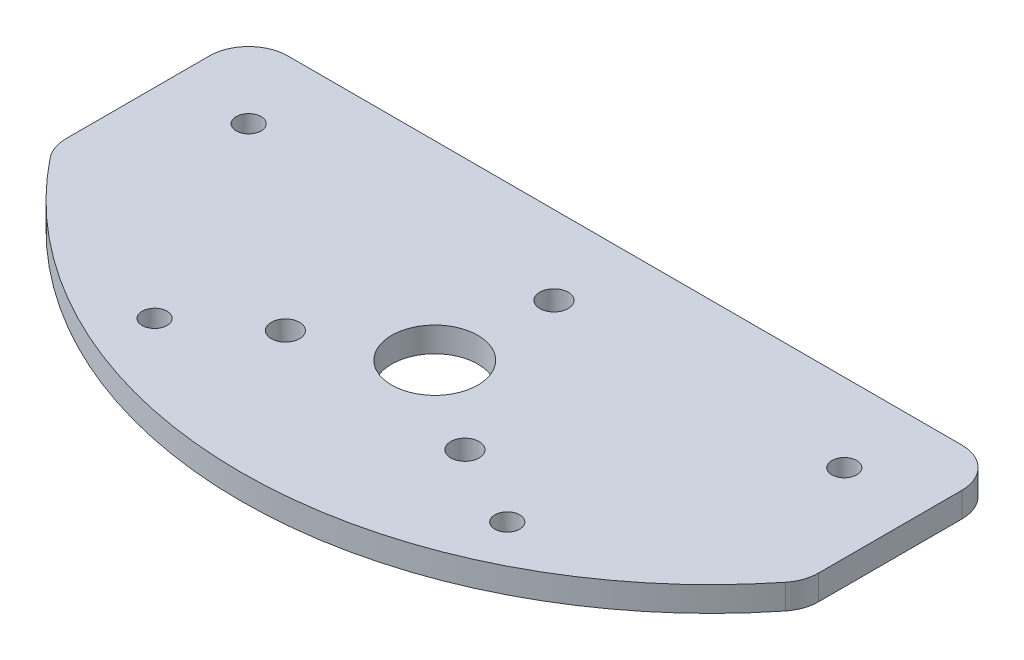
ISO-10303-21;
HEADER;
FILE_DESCRIPTION(('STEP AP214'),'2;1');
FILE_NAME('part.step','',(''),(''),'','','');
FILE_SCHEMA(('AUTOMOTIVE_DESIGN { 1 0 10303 214 1 1 1 1 }'));
ENDSEC;
DATA;
#1=APPLICATION_CONTEXT('core data for automotive mechanical design processes');
#2=APPLICATION_PROTOCOL_DEFINITION('international standard','automotive_design',2000,#1);
#3=PRODUCT_CONTEXT('',#1,'mechanical');
#4=PRODUCT('Part','Part','',(#3));
#5=PRODUCT_RELATED_PRODUCT_CATEGORY('part','',(#4));
#6=PRODUCT_DEFINITION_FORMATION('','',#4);
#7=PRODUCT_DEFINITION_CONTEXT('part definition',#1,'design');
#8=PRODUCT_DEFINITION('design','',#6,#7);
#9=PRODUCT_DEFINITION_SHAPE('','',#8);
#10=(LENGTH_UNIT() NAMED_UNIT(*) SI_UNIT(.MILLI.,.METRE.));
#11=(NAMED_UNIT(*) PLANE_ANGLE_UNIT() SI_UNIT($,.RADIAN.));
#12=(NAMED_UNIT(*) SI_UNIT($,.STERADIAN.) SOLID_ANGLE_UNIT());
#13=UNCERTAINTY_MEASURE_WITH_UNIT(LENGTH_MEASURE(1.E-05),#10,'distance_accuracy_value','');
#14=(GEOMETRIC_REPRESENTATION_CONTEXT(3) GLOBAL_UNCERTAINTY_ASSIGNED_CONTEXT((#13)) GLOBAL_UNIT_ASSIGNED_CONTEXT((#10,
#11,#12)) REPRESENTATION_CONTEXT('',''));
#15=CARTESIAN_POINT('',(0.,0.,0.));
#16=DIRECTION('',(0.,0.,1.));
#17=DIRECTION('',(1.,0.,0.));
#18=AXIS2_PLACEMENT_3D('',#15,#16,#17);
#19=CARTESIAN_POINT('',(1.11022302462516E-13,6.36,0.));
#20=DIRECTION('',(0.,1.,0.));
#21=DIRECTION('',(0.,0.,1.));
#22=AXIS2_PLACEMENT_3D('',#19,#20,#21);
#23=PLANE('',#22);
#24=CARTESIAN_POINT('',(1.98805950170758,6.36,-28.430575432405));
#25=DIRECTION('',(0.,1.,0.));
#26=DIRECTION('',(0.,0.,1.));
#27=AXIS2_PLACEMENT_3D('',#24,#25,#26);
#28=CIRCLE('',#27,3.625);
#29=CARTESIAN_POINT('',(1.98805950170758,6.36,-24.805575432405));
#30=VERTEX_POINT('',#29);
#31=EDGE_CURVE('E374',#30,#30,#28,.T.);
#32=ORIENTED_EDGE('',*,*,#31,.F.);
#33=EDGE_LOOP('',(#32));
#34=FACE_BOUND('',#33,.T.);
#35=CARTESIAN_POINT('',(23.6275708178187,6.36,15.9369977489163));
#36=DIRECTION('',(0.,1.,0.));
#37=DIRECTION('',(0.,0.,1.));
#38=AXIS2_PLACEMENT_3D('',#35,#36,#37);
#39=CIRCLE('',#38,3.625);
#40=CARTESIAN_POINT('',(23.6275708178187,6.36,19.5619977489163));
#41=VERTEX_POINT('',#40);
#42=EDGE_CURVE('E382',#41,#41,#39,.T.);
#43=ORIENTED_EDGE('',*,*,#42,.F.);
#44=EDGE_LOOP('',(#43));
#45=FACE_BOUND('',#44,.T.);
#46=CARTESIAN_POINT('',(-25.6156303195263,6.36,12.4935776834887));
#47=DIRECTION('',(0.,1.,0.));
#48=DIRECTION('',(0.,0.,1.));
#49=AXIS2_PLACEMENT_3D('',#46,#47,#48);
#50=CIRCLE('',#49,3.625);
#51=CARTESIAN_POINT('',(-25.6156303195263,6.36,16.1185776834887));
#52=VERTEX_POINT('',#51);
#53=EDGE_CURVE('E388',#52,#52,#50,.T.);
#54=ORIENTED_EDGE('',*,*,#53,.F.);
#55=EDGE_LOOP('',(#54));
#56=FACE_BOUND('',#55,.T.);
#57=CARTESIAN_POINT('',(-76.,6.36,-28.4999999999999));
#58=DIRECTION('',(0.,1.,0.));
#59=DIRECTION('',(0.,0.,1.));
#60=AXIS2_PLACEMENT_3D('',#57,#58,#59);
#61=CIRCLE('',#60,3.175);
#62=CARTESIAN_POINT('',(-76.,6.36,-25.3249999999999));
#63=VERTEX_POINT('',#62);
#64=EDGE_CURVE('E393',#63,#63,#61,.T.);
#65=ORIENTED_EDGE('',*,*,#64,.F.);
#66=EDGE_LOOP('',(#65));
#67=FACE_BOUND('',#66,.T.);
#68=CARTESIAN_POINT('',(-45.,6.36,26.5));
#69=DIRECTION('',(0.,1.,0.));
#70=DIRECTION('',(0.,0.,1.));
#71=AXIS2_PLACEMENT_3D('',#68,#69,#70);
#72=CIRCLE('',#71,3.175);
#73=CARTESIAN_POINT('',(-45.,6.36,29.6750000000001));
#74=VERTEX_POINT('',#73);
#75=EDGE_CURVE('E399',#74,#74,#72,.T.);
#76=ORIENTED_EDGE('',*,*,#75,.F.);
#77=EDGE_LOOP('',(#76));
#78=FACE_BOUND('',#77,.T.);
#79=CARTESIAN_POINT('',(45.,6.36,26.5));
#80=DIRECTION('',(0.,1.,0.));
#81=DIRECTION('',(0.,0.,-1.));
#82=AXIS2_PLACEMENT_3D('',#79,#80,#81);
#83=CIRCLE('',#82,3.175);
#84=CARTESIAN_POINT('',(45.,6.36,23.325));
#85=VERTEX_POINT('',#84);
#86=EDGE_CURVE('E372',#85,#85,#83,.T.);
#87=ORIENTED_EDGE('',*,*,#86,.F.);
#88=EDGE_LOOP('',(#87));
#89=FACE_BOUND('',#88,.T.);
#90=CARTESIAN_POINT('',(76.,6.36,-28.5));
#91=DIRECTION('',(0.,1.,0.));
#92=DIRECTION('',(0.,0.,-1.));
#93=AXIS2_PLACEMENT_3D('',#90,#91,#92);
#94=CIRCLE('',#93,3.175);
#95=CARTESIAN_POINT('',(76.,6.36,-31.675));
#96=VERTEX_POINT('',#95);
#97=EDGE_CURVE('E180',#96,#96,#94,.T.);
#98=ORIENTED_EDGE('',*,*,#97,.F.);
#99=EDGE_LOOP('',(#98));
#100=FACE_BOUND('',#99,.T.);
#101=CARTESIAN_POINT('',(1.11022302462516E-13,6.36,0.));
#102=DIRECTION('',(0.,1.,0.));
#103=DIRECTION('',(0.,0.,1.));
#104=AXIS2_PLACEMENT_3D('',#101,#102,#103);
#105=CIRCLE('',#104,11.);
#106=CARTESIAN_POINT('',(1.11022302462516E-13,6.36,11.));
#107=VERTEX_POINT('',#106);
#108=EDGE_CURVE('E174',#107,#107,#105,.T.);
#109=ORIENTED_EDGE('',*,*,#108,.F.);
#110=EDGE_LOOP('',(#109));
#111=FACE_BOUND('',#110,.T.);
#112=DIRECTION('',(0.,0.,-1.));
#113=VECTOR('',#112,1.);
#114=CARTESIAN_POINT('',(96.,6.36,-48.4999999999999));
#115=LINE('',#114,#113);
#116=CARTESIAN_POINT('',(96.,6.36,-1.91428720207132));
#117=VERTEX_POINT('',#116);
#118=CARTESIAN_POINT('',(96.,6.36,-38.4999999999999));
#119=VERTEX_POINT('',#118);
#120=EDGE_CURVE('E167',#117,#119,#115,.T.);
#121=ORIENTED_EDGE('',*,*,#120,.T.);
#122=CARTESIAN_POINT('',(86.,6.36,-38.4999999999999));
#123=DIRECTION('',(0.,1.,0.));
#124=DIRECTION('',(0.,0.,1.));
#125=AXIS2_PLACEMENT_3D('',#122,#123,#124);
#126=CIRCLE('',#125,10.);
#127=CARTESIAN_POINT('',(86.,6.36,-48.4999999999999));
#128=VERTEX_POINT('',#127);
#129=EDGE_CURVE('E120',#119,#128,#126,.T.);
#130=ORIENTED_EDGE('',*,*,#129,.T.);
#131=DIRECTION('',(-1.,0.,0.));
#132=VECTOR('',#131,1.);
#133=CARTESIAN_POINT('',(-96.,6.36,-48.4999999999999));
#134=LINE('',#133,#132);
#135=CARTESIAN_POINT('',(-86.,6.36,-48.4999999999999));
#136=VERTEX_POINT('',#135);
#137=EDGE_CURVE('E117',#128,#136,#134,.T.);
#138=ORIENTED_EDGE('',*,*,#137,.T.);
#139=CARTESIAN_POINT('',(-86.,6.36,-38.4999999999999));
#140=DIRECTION('',(0.,1.,0.));
#141=DIRECTION('',(0.,0.,1.));
#142=AXIS2_PLACEMENT_3D('',#139,#140,#141);
#143=CIRCLE('',#142,10.);
#144=CARTESIAN_POINT('',(-96.,6.36,-38.4999999999999));
#145=VERTEX_POINT('',#144);
#146=EDGE_CURVE('E121',#136,#145,#143,.T.);
#147=ORIENTED_EDGE('',*,*,#146,.T.);
#148=DIRECTION('',(0.,0.,1.));
#149=VECTOR('',#148,1.);
#150=CARTESIAN_POINT('',(-96.,6.36,-48.4999999999999));
#151=LINE('',#150,#149);
#152=CARTESIAN_POINT('',(-96.,6.36,-1.91428720207104));
#153=VERTEX_POINT('',#152);
#154=EDGE_CURVE('E155',#145,#153,#151,.T.);
#155=ORIENTED_EDGE('',*,*,#154,.T.);
#156=CARTESIAN_POINT('',(-86.,6.36,-1.91428720207104));
#157=DIRECTION('',(0.,1.,0.));
#158=DIRECTION('',(0.,0.,1.));
#159=AXIS2_PLACEMENT_3D('',#156,#157,#158);
#160=CIRCLE('',#159,10.);
#161=CARTESIAN_POINT('',(-93.8181818181818,6.36,4.3207775977407));
#162=VERTEX_POINT('',#161);
#163=EDGE_CURVE('E123',#153,#162,#160,.T.);
#164=ORIENTED_EDGE('',*,*,#163,.T.);
#165=CARTESIAN_POINT('',(-1.11022302462516E-13,6.36,-70.5000000000001));
#166=DIRECTION('',(0.,1.,0.));
#167=DIRECTION('',(0.,0.,-1.));
#168=AXIS2_PLACEMENT_3D('',#165,#166,#167);
#169=CIRCLE('',#168,120.);
#170=CARTESIAN_POINT('',(93.8181818181818,6.36,4.3207775977404));
#171=VERTEX_POINT('',#170);
#172=EDGE_CURVE('E169',#162,#171,#169,.T.);
#173=ORIENTED_EDGE('',*,*,#172,.T.);
#174=CARTESIAN_POINT('',(86.,6.36,-1.91428720207132));
#175=DIRECTION('',(0.,1.,0.));
#176=DIRECTION('',(0.,0.,1.));
#177=AXIS2_PLACEMENT_3D('',#174,#175,#176);
#178=CIRCLE('',#177,10.);
#179=EDGE_CURVE('E130',#171,#117,#178,.T.);
#180=ORIENTED_EDGE('',*,*,#179,.T.);
#181=EDGE_LOOP('',(#121,#130,#138,#147,#155,#164,#173,#180));
#182=FACE_BOUND('',#181,.T.);
#183=ADVANCED_FACE('F33',(#34,#45,#56,#67,#78,#89,#100,#111,#182),#23,.T.);
#184=CARTESIAN_POINT('',(1.11022302462516E-13,0.,0.));
#185=DIRECTION('',(0.,1.,0.));
#186=DIRECTION('',(0.,0.,1.));
#187=AXIS2_PLACEMENT_3D('',#184,#185,#186);
#188=PLANE('',#187);
#189=CARTESIAN_POINT('',(1.98805950170758,0.,-28.430575432405));
#190=DIRECTION('',(0.,1.,0.));
#191=DIRECTION('',(0.,0.,1.));
#192=AXIS2_PLACEMENT_3D('',#189,#190,#191);
#193=CIRCLE('',#192,3.625);
#194=CARTESIAN_POINT('',(1.98805950170758,0.,-24.805575432405));
#195=VERTEX_POINT('',#194);
#196=EDGE_CURVE('E371',#195,#195,#193,.T.);
#197=ORIENTED_EDGE('',*,*,#196,.T.);
#198=EDGE_LOOP('',(#197));
#199=FACE_BOUND('',#198,.T.);
#200=CARTESIAN_POINT('',(23.6275708178187,0.,15.9369977489163));
#201=DIRECTION('',(0.,1.,0.));
#202=DIRECTION('',(0.,0.,1.));
#203=AXIS2_PLACEMENT_3D('',#200,#201,#202);
#204=CIRCLE('',#203,3.625);
#205=CARTESIAN_POINT('',(23.6275708178187,0.,19.5619977489163));
#206=VERTEX_POINT('',#205);
#207=EDGE_CURVE('E377',#206,#206,#204,.T.);
#208=ORIENTED_EDGE('',*,*,#207,.T.);
#209=EDGE_LOOP('',(#208));
#210=FACE_BOUND('',#209,.T.);
#211=CARTESIAN_POINT('',(-25.6156303195263,0.,12.4935776834887));
#212=DIRECTION('',(0.,1.,0.));
#213=DIRECTION('',(0.,0.,1.));
#214=AXIS2_PLACEMENT_3D('',#211,#212,#213);
#215=CIRCLE('',#214,3.625);
#216=CARTESIAN_POINT('',(-25.6156303195263,0.,16.1185776834887));
#217=VERTEX_POINT('',#216);
#218=EDGE_CURVE('E385',#217,#217,#215,.T.);
#219=ORIENTED_EDGE('',*,*,#218,.T.);
#220=EDGE_LOOP('',(#219));
#221=FACE_BOUND('',#220,.T.);
#222=CARTESIAN_POINT('',(-76.,0.,-28.4999999999999));
#223=DIRECTION('',(0.,1.,0.));
#224=DIRECTION('',(0.,0.,1.));
#225=AXIS2_PLACEMENT_3D('',#222,#223,#224);
#226=CIRCLE('',#225,3.175);
#227=CARTESIAN_POINT('',(-76.,0.,-25.3249999999999));
#228=VERTEX_POINT('',#227);
#229=EDGE_CURVE('E184',#228,#228,#226,.T.);
#230=ORIENTED_EDGE('',*,*,#229,.T.);
#231=EDGE_LOOP('',(#230));
#232=FACE_BOUND('',#231,.T.);
#233=CARTESIAN_POINT('',(-45.,0.,26.5));
#234=DIRECTION('',(0.,1.,0.));
#235=DIRECTION('',(0.,0.,1.));
#236=AXIS2_PLACEMENT_3D('',#233,#234,#235);
#237=CIRCLE('',#236,3.175);
#238=CARTESIAN_POINT('',(-45.,0.,29.6750000000001));
#239=VERTEX_POINT('',#238);
#240=EDGE_CURVE('E396',#239,#239,#237,.T.);
#241=ORIENTED_EDGE('',*,*,#240,.T.);
#242=EDGE_LOOP('',(#241));
#243=FACE_BOUND('',#242,.T.);
#244=CARTESIAN_POINT('',(45.,0.,26.5));
#245=DIRECTION('',(0.,1.,0.));
#246=DIRECTION('',(0.,0.,-1.));
#247=AXIS2_PLACEMENT_3D('',#244,#245,#246);
#248=CIRCLE('',#247,3.175);
#249=CARTESIAN_POINT('',(45.,0.,23.325));
#250=VERTEX_POINT('',#249);
#251=EDGE_CURVE('E402',#250,#250,#248,.T.);
#252=ORIENTED_EDGE('',*,*,#251,.T.);
#253=EDGE_LOOP('',(#252));
#254=FACE_BOUND('',#253,.T.);
#255=CARTESIAN_POINT('',(76.,0.,-28.5));
#256=DIRECTION('',(0.,1.,0.));
#257=DIRECTION('',(0.,0.,-1.));
#258=AXIS2_PLACEMENT_3D('',#255,#256,#257);
#259=CIRCLE('',#258,3.175);
#260=CARTESIAN_POINT('',(76.,0.,-31.675));
#261=VERTEX_POINT('',#260);
#262=EDGE_CURVE('E367',#261,#261,#259,.T.);
#263=ORIENTED_EDGE('',*,*,#262,.T.);
#264=EDGE_LOOP('',(#263));
#265=FACE_BOUND('',#264,.T.);
#266=CARTESIAN_POINT('',(1.11022302462516E-13,0.,0.));
#267=DIRECTION('',(0.,1.,0.));
#268=DIRECTION('',(0.,0.,1.));
#269=AXIS2_PLACEMENT_3D('',#266,#267,#268);
#270=CIRCLE('',#269,11.);
#271=CARTESIAN_POINT('',(1.11022302462516E-13,0.,11.));
#272=VERTEX_POINT('',#271);
#273=EDGE_CURVE('E125',#272,#272,#270,.T.);
#274=ORIENTED_EDGE('',*,*,#273,.T.);
#275=EDGE_LOOP('',(#274));
#276=FACE_BOUND('',#275,.T.);
#277=DIRECTION('',(1.,0.,0.));
#278=VECTOR('',#277,1.);
#279=CARTESIAN_POINT('',(-96.,0.,-48.4999999999999));
#280=LINE('',#279,#278);
#281=CARTESIAN_POINT('',(-86.,0.,-48.4999999999999));
#282=VERTEX_POINT('',#281);
#283=CARTESIAN_POINT('',(86.,0.,-48.4999999999999));
#284=VERTEX_POINT('',#283);
#285=EDGE_CURVE('E104',#282,#284,#280,.T.);
#286=ORIENTED_EDGE('',*,*,#285,.T.);
#287=CARTESIAN_POINT('',(86.,0.,-38.4999999999999));
#288=DIRECTION('',(0.,1.,0.));
#289=DIRECTION('',(0.,0.,1.));
#290=AXIS2_PLACEMENT_3D('',#287,#288,#289);
#291=CIRCLE('',#290,10.);
#292=CARTESIAN_POINT('',(96.,0.,-38.4999999999999));
#293=VERTEX_POINT('',#292);
#294=EDGE_CURVE('E99',#284,#293,#291,.F.);
#295=ORIENTED_EDGE('',*,*,#294,.T.);
#296=DIRECTION('',(0.,0.,1.));
#297=VECTOR('',#296,1.);
#298=CARTESIAN_POINT('',(96.,0.,-48.4999999999999));
#299=LINE('',#298,#297);
#300=CARTESIAN_POINT('',(96.,0.,-1.91428720207132));
#301=VERTEX_POINT('',#300);
#302=EDGE_CURVE('E102',#293,#301,#299,.T.);
#303=ORIENTED_EDGE('',*,*,#302,.T.);
#304=CARTESIAN_POINT('',(86.,0.,-1.91428720207132));
#305=DIRECTION('',(0.,1.,0.));
#306=DIRECTION('',(0.,0.,1.));
#307=AXIS2_PLACEMENT_3D('',#304,#305,#306);
#308=CIRCLE('',#307,10.);
#309=CARTESIAN_POINT('',(93.8181818181818,0.,4.3207775977404));
#310=VERTEX_POINT('',#309);
#311=EDGE_CURVE('E55',#301,#310,#308,.F.);
#312=ORIENTED_EDGE('',*,*,#311,.T.);
#313=CARTESIAN_POINT('',(-1.11022302462516E-13,0.,-70.5000000000001));
#314=DIRECTION('',(0.,1.,0.));
#315=DIRECTION('',(0.,0.,1.));
#316=AXIS2_PLACEMENT_3D('',#313,#314,#315);
#317=CIRCLE('',#316,120.);
#318=CARTESIAN_POINT('',(-93.8181818181818,0.,4.3207775977407));
#319=VERTEX_POINT('',#318);
#320=EDGE_CURVE('E159',#310,#319,#317,.F.);
#321=ORIENTED_EDGE('',*,*,#320,.T.);
#322=CARTESIAN_POINT('',(-86.,0.,-1.91428720207104));
#323=DIRECTION('',(0.,1.,0.));
#324=DIRECTION('',(0.,0.,1.));
#325=AXIS2_PLACEMENT_3D('',#322,#323,#324);
#326=CIRCLE('',#325,10.);
#327=CARTESIAN_POINT('',(-96.,0.,-1.91428720207104));
#328=VERTEX_POINT('',#327);
#329=EDGE_CURVE('E140',#319,#328,#326,.F.);
#330=ORIENTED_EDGE('',*,*,#329,.T.);
#331=DIRECTION('',(0.,0.,-1.));
#332=VECTOR('',#331,1.);
#333=CARTESIAN_POINT('',(-96.,0.,-48.4999999999999));
#334=LINE('',#333,#332);
#335=CARTESIAN_POINT('',(-96.,0.,-38.4999999999999));
#336=VERTEX_POINT('',#335);
#337=EDGE_CURVE('E152',#328,#336,#334,.T.);
#338=ORIENTED_EDGE('',*,*,#337,.T.);
#339=CARTESIAN_POINT('',(-86.,0.,-38.4999999999999));
#340=DIRECTION('',(0.,1.,0.));
#341=DIRECTION('',(0.,0.,1.));
#342=AXIS2_PLACEMENT_3D('',#339,#340,#341);
#343=CIRCLE('',#342,10.);
#344=EDGE_CURVE('E138',#336,#282,#343,.F.);
#345=ORIENTED_EDGE('',*,*,#344,.T.);
#346=EDGE_LOOP('',(#286,#295,#303,#312,#321,#330,#338,#345));
#347=FACE_BOUND('',#346,.T.);
#348=ADVANCED_FACE('F101',(#199,#210,#221,#232,#243,#254,#265,#276,#347),#188,.F.);
#349=CARTESIAN_POINT('',(1.11022302462516E-13,0.,0.));
#350=DIRECTION('',(0.,1.,0.));
#351=DIRECTION('',(0.,0.,1.));
#352=AXIS2_PLACEMENT_3D('',#349,#350,#351);
#353=CYLINDRICAL_SURFACE('',#352,11.);
#354=CARTESIAN_POINT('',(1.11022302462516E-13,0.,11.));
#355=CARTESIAN_POINT('',(1.11022302462516E-13,0.0662499999999999,11.));
#356=CARTESIAN_POINT('',(1.11022302462516E-13,0.1325,11.));
#357=CARTESIAN_POINT('',(1.11022302462516E-13,0.265,11.));
#358=CARTESIAN_POINT('',(1.11022302462516E-13,0.33125,11.));
#359=CARTESIAN_POINT('',(1.11022302462516E-13,0.46375,11.));
#360=CARTESIAN_POINT('',(1.11022302462516E-13,0.53,11.));
#361=CARTESIAN_POINT('',(1.11022302462516E-13,0.6625,11.));
#362=CARTESIAN_POINT('',(1.11022302462516E-13,0.72875,11.));
#363=CARTESIAN_POINT('',(1.11022302462516E-13,0.86125,11.));
#364=CARTESIAN_POINT('',(1.11022302462516E-13,0.9275,11.));
#365=CARTESIAN_POINT('',(1.11022302462516E-13,1.06,11.));
#366=CARTESIAN_POINT('',(1.11022302462516E-13,1.12625,11.));
#367=CARTESIAN_POINT('',(1.11022302462516E-13,1.25875,11.));
#368=CARTESIAN_POINT('',(1.11022302462516E-13,1.325,11.));
#369=CARTESIAN_POINT('',(1.11022302462516E-13,1.4575,11.));
#370=CARTESIAN_POINT('',(1.11022302462516E-13,1.52375,11.));
#371=CARTESIAN_POINT('',(1.11022302462516E-13,1.65625,11.));
#372=CARTESIAN_POINT('',(1.11022302462516E-13,1.7225,11.));
#373=CARTESIAN_POINT('',(1.11022302462516E-13,1.855,11.));
#374=CARTESIAN_POINT('',(1.11022302462516E-13,1.92125,11.));
#375=CARTESIAN_POINT('',(1.11022302462516E-13,2.05375,11.));
#376=CARTESIAN_POINT('',(1.11022302462516E-13,2.12,11.));
#377=CARTESIAN_POINT('',(1.11022302462516E-13,2.2525,11.));
#378=CARTESIAN_POINT('',(1.11022302462516E-13,2.31875,11.));
#379=CARTESIAN_POINT('',(1.11022302462516E-13,2.45125,11.));
#380=CARTESIAN_POINT('',(1.11022302462516E-13,2.5175,11.));
#381=CARTESIAN_POINT('',(1.11022302462516E-13,2.65,11.));
#382=CARTESIAN_POINT('',(1.11022302462516E-13,2.71625,11.));
#383=CARTESIAN_POINT('',(1.11022302462516E-13,2.84875,11.));
#384=CARTESIAN_POINT('',(1.11022302462516E-13,2.915,11.));
#385=CARTESIAN_POINT('',(1.11022302462516E-13,3.0475,11.));
#386=CARTESIAN_POINT('',(1.11022302462516E-13,3.11375,11.));
#387=CARTESIAN_POINT('',(1.11022302462516E-13,3.24625,11.));
#388=CARTESIAN_POINT('',(1.11022302462516E-13,3.3125,11.));
#389=CARTESIAN_POINT('',(1.11022302462516E-13,3.445,11.));
#390=CARTESIAN_POINT('',(1.11022302462516E-13,3.51125,11.));
#391=CARTESIAN_POINT('',(1.11022302462516E-13,3.64375,11.));
#392=CARTESIAN_POINT('',(1.11022302462516E-13,3.71,11.));
#393=CARTESIAN_POINT('',(1.11022302462516E-13,3.8425,11.));
#394=CARTESIAN_POINT('',(1.11022302462516E-13,3.90875,11.));
#395=CARTESIAN_POINT('',(1.11022302462516E-13,4.04125,11.));
#396=CARTESIAN_POINT('',(1.11022302462516E-13,4.1075,11.));
#397=CARTESIAN_POINT('',(1.11022302462516E-13,4.24,11.));
#398=CARTESIAN_POINT('',(1.11022302462516E-13,4.30625,11.));
#399=CARTESIAN_POINT('',(1.11022302462516E-13,4.43875,11.));
#400=CARTESIAN_POINT('',(1.11022302462516E-13,4.505,11.));
#401=CARTESIAN_POINT('',(1.11022302462516E-13,4.6375,11.));
#402=CARTESIAN_POINT('',(1.11022302462516E-13,4.70375,11.));
#403=CARTESIAN_POINT('',(1.11022302462516E-13,4.83625,11.));
#404=CARTESIAN_POINT('',(1.11022302462516E-13,4.9025,11.));
#405=CARTESIAN_POINT('',(1.11022302462516E-13,5.035,11.));
#406=CARTESIAN_POINT('',(1.11022302462516E-13,5.10125,11.));
#407=CARTESIAN_POINT('',(1.11022302462516E-13,5.23375,11.));
#408=CARTESIAN_POINT('',(1.11022302462516E-13,5.3,11.));
#409=CARTESIAN_POINT('',(1.11022302462516E-13,5.4325,11.));
#410=CARTESIAN_POINT('',(1.11022302462516E-13,5.49875,11.));
#411=CARTESIAN_POINT('',(1.11022302462516E-13,5.63125,11.));
#412=CARTESIAN_POINT('',(1.11022302462516E-13,5.6975,11.));
#413=CARTESIAN_POINT('',(1.11022302462516E-13,5.83,11.));
#414=CARTESIAN_POINT('',(1.11022302462516E-13,5.89625,11.));
#415=CARTESIAN_POINT('',(1.11022302462516E-13,6.02875,11.));
#416=CARTESIAN_POINT('',(1.11022302462516E-13,6.095,11.));
#417=CARTESIAN_POINT('',(1.11022302462516E-13,6.2275,11.));
#418=CARTESIAN_POINT('',(1.11022302462516E-13,6.29375,11.));
#419=CARTESIAN_POINT('',(1.11022302462516E-13,6.36,11.));
#420=B_SPLINE_CURVE_WITH_KNOTS('',3,(#354,#355,#356,#357,#358,#359,#360,#361,#362,#363,#364,
#365,#366,#367,#368,#369,#370,#371,#372,#373,#374,#375,#376,#377,#378,#379,#380,#381,#382,#383,
#384,#385,#386,#387,#388,#389,#390,#391,#392,#393,#394,#395,#396,#397,#398,#399,#400,#401,#402,
#403,#404,#405,#406,#407,#408,#409,#410,#411,#412,#413,#414,#415,#416,#417,#418,#419),
.UNSPECIFIED.,.F.,.F.,(4,2,2,2,2,2,2,2,2,2,2,2,2,2,2,2,2,2,2,2,2,2,2,2,2,2,2,2,2,2,2,2,4),(0.,
0.19875,0.3975,0.59625,0.795,0.99375,1.1925,1.39125,1.59,1.78875,1.9875,2.18625,2.385,2.58375,
2.7825,2.98125,3.18,3.37875,3.5775,3.77625,3.975,4.17375,4.3725,4.57125,4.77,4.96875,5.1675,
5.36625,5.565,5.76375,5.9625,6.16125,6.36),.UNSPECIFIED.);
#421=EDGE_CURVE('BSEAM204',#272,#107,#420,.T.);
#422=ORIENTED_EDGE('',*,*,#273,.F.);
#423=ORIENTED_EDGE('',*,*,#108,.T.);
#424=ORIENTED_EDGE('',*,*,#421,.T.);
#425=ORIENTED_EDGE('',*,*,#421,.F.);
#426=EDGE_LOOP('',(#422,#424,#423,#425));
#427=FACE_BOUND('',#426,.T.);
#428=ADVANCED_FACE('F204',(#427),#353,.F.);
#429=CARTESIAN_POINT('',(-1.11022302462516E-13,-215.564375535477,-70.5000000000001));
#430=DIRECTION('',(0.,1.,0.));
#431=DIRECTION('',(0.,0.,1.));
#432=AXIS2_PLACEMENT_3D('',#429,#430,#431);
#433=CYLINDRICAL_SURFACE('',#432,120.);
#434=ORIENTED_EDGE('',*,*,#320,.F.);
#435=DIRECTION('',(0.,1.,0.));
#436=VECTOR('',#435,1.);
#437=CARTESIAN_POINT('',(93.8181818181818,-215.564375535477,4.32077759774038));
#438=LINE('',#437,#436);
#439=EDGE_CURVE('E144',#310,#171,#438,.T.);
#440=ORIENTED_EDGE('',*,*,#439,.T.);
#441=ORIENTED_EDGE('',*,*,#172,.F.);
#442=DIRECTION('',(0.,1.,0.));
#443=VECTOR('',#442,1.);
#444=CARTESIAN_POINT('',(-93.8181818181818,-215.564375535477,4.32077759774069));
#445=LINE('',#444,#443);
#446=EDGE_CURVE('E48',#162,#319,#445,.F.);
#447=ORIENTED_EDGE('',*,*,#446,.T.);
#448=EDGE_LOOP('',(#434,#440,#441,#447));
#449=FACE_BOUND('',#448,.T.);
#450=ADVANCED_FACE('F186',(#449),#433,.T.);
#451=CARTESIAN_POINT('',(96.,-215.564375535477,-48.4999999999999));
#452=DIRECTION('',(1.,0.,0.));
#453=DIRECTION('',(0.,0.,-1.));
#454=AXIS2_PLACEMENT_3D('',#451,#452,#453);
#455=PLANE('',#454);
#456=ORIENTED_EDGE('',*,*,#302,.F.);
#457=DIRECTION('',(0.,1.,0.));
#458=VECTOR('',#457,1.);
#459=CARTESIAN_POINT('',(96.,-215.564375535477,-38.4999999999999));
#460=LINE('',#459,#458);
#461=EDGE_CURVE('E113',#293,#119,#460,.T.);
#462=ORIENTED_EDGE('',*,*,#461,.T.);
#463=ORIENTED_EDGE('',*,*,#120,.F.);
#464=DIRECTION('',(0.,1.,0.));
#465=VECTOR('',#464,1.);
#466=CARTESIAN_POINT('',(96.,-215.564375535477,-1.91428720207132));
#467=LINE('',#466,#465);
#468=EDGE_CURVE('E116',#117,#301,#467,.F.);
#469=ORIENTED_EDGE('',*,*,#468,.T.);
#470=EDGE_LOOP('',(#456,#462,#463,#469));
#471=FACE_BOUND('',#470,.T.);
#472=ADVANCED_FACE('F111',(#471),#455,.T.);
#473=CARTESIAN_POINT('',(-96.,-215.564375535477,-48.4999999999999));
#474=DIRECTION('',(0.,0.,-1.));
#475=DIRECTION('',(-1.,0.,0.));
#476=AXIS2_PLACEMENT_3D('',#473,#474,#475);
#477=PLANE('',#476);
#478=ORIENTED_EDGE('',*,*,#137,.F.);
#479=DIRECTION('',(0.,1.,0.));
#480=VECTOR('',#479,1.);
#481=CARTESIAN_POINT('',(86.,-215.564375535477,-48.4999999999999));
#482=LINE('',#481,#480);
#483=EDGE_CURVE('E136',#128,#284,#482,.F.);
#484=ORIENTED_EDGE('',*,*,#483,.T.);
#485=ORIENTED_EDGE('',*,*,#285,.F.);
#486=DIRECTION('',(0.,1.,0.));
#487=VECTOR('',#486,1.);
#488=CARTESIAN_POINT('',(-86.,-215.564375535477,-48.4999999999999));
#489=LINE('',#488,#487);
#490=EDGE_CURVE('E133',#282,#136,#489,.T.);
#491=ORIENTED_EDGE('',*,*,#490,.T.);
#492=EDGE_LOOP('',(#478,#484,#485,#491));
#493=FACE_BOUND('',#492,.T.);
#494=ADVANCED_FACE('F165',(#493),#477,.T.);
#495=CARTESIAN_POINT('',(-96.,-215.564375535477,-48.4999999999999));
#496=DIRECTION('',(-1.,0.,0.));
#497=DIRECTION('',(0.,0.,1.));
#498=AXIS2_PLACEMENT_3D('',#495,#496,#497);
#499=PLANE('',#498);
#500=ORIENTED_EDGE('',*,*,#337,.F.);
#501=DIRECTION('',(0.,1.,0.));
#502=VECTOR('',#501,1.);
#503=CARTESIAN_POINT('',(-96.,-215.564375535477,-1.91428720207104));
#504=LINE('',#503,#502);
#505=EDGE_CURVE('E11',#328,#153,#504,.T.);
#506=ORIENTED_EDGE('',*,*,#505,.T.);
#507=ORIENTED_EDGE('',*,*,#154,.F.);
#508=DIRECTION('',(0.,1.,0.));
#509=VECTOR('',#508,1.);
#510=CARTESIAN_POINT('',(-96.,-215.564375535477,-38.4999999999999));
#511=LINE('',#510,#509);
#512=EDGE_CURVE('E41',#145,#336,#511,.F.);
#513=ORIENTED_EDGE('',*,*,#512,.T.);
#514=EDGE_LOOP('',(#500,#506,#507,#513));
#515=FACE_BOUND('',#514,.T.);
#516=ADVANCED_FACE('F151',(#515),#499,.T.);
#517=CARTESIAN_POINT('',(76.,0.,-28.5));
#518=DIRECTION('',(0.,1.,0.));
#519=DIRECTION('',(0.,0.,1.));
#520=AXIS2_PLACEMENT_3D('',#517,#518,#519);
#521=CYLINDRICAL_SURFACE('',#520,3.175);
#522=ORIENTED_EDGE('',*,*,#262,.F.);
#523=EDGE_LOOP('',(#522));
#524=FACE_BOUND('',#523,.T.);
#525=ORIENTED_EDGE('',*,*,#97,.T.);
#526=EDGE_LOOP('',(#525));
#527=FACE_BOUND('',#526,.T.);
#528=ADVANCED_FACE('F243',(#524,#527),#521,.F.);
#529=CARTESIAN_POINT('',(45.,0.,26.5));
#530=DIRECTION('',(0.,1.,0.));
#531=DIRECTION('',(0.,0.,1.));
#532=AXIS2_PLACEMENT_3D('',#529,#530,#531);
#533=CYLINDRICAL_SURFACE('',#532,3.175);
#534=ORIENTED_EDGE('',*,*,#251,.F.);
#535=EDGE_LOOP('',(#534));
#536=FACE_BOUND('',#535,.T.);
#537=ORIENTED_EDGE('',*,*,#86,.T.);
#538=EDGE_LOOP('',(#537));
#539=FACE_BOUND('',#538,.T.);
#540=ADVANCED_FACE('F239',(#536,#539),#533,.F.);
#541=CARTESIAN_POINT('',(-45.,0.,26.5));
#542=DIRECTION('',(0.,1.,0.));
#543=DIRECTION('',(0.,0.,1.));
#544=AXIS2_PLACEMENT_3D('',#541,#542,#543);
#545=CYLINDRICAL_SURFACE('',#544,3.175);
#546=ORIENTED_EDGE('',*,*,#240,.F.);
#547=EDGE_LOOP('',(#546));
#548=FACE_BOUND('',#547,.T.);
#549=ORIENTED_EDGE('',*,*,#75,.T.);
#550=EDGE_LOOP('',(#549));
#551=FACE_BOUND('',#550,.T.);
#552=ADVANCED_FACE('F235',(#548,#551),#545,.F.);
#553=CARTESIAN_POINT('',(-76.,0.,-28.4999999999999));
#554=DIRECTION('',(0.,1.,0.));
#555=DIRECTION('',(0.,0.,1.));
#556=AXIS2_PLACEMENT_3D('',#553,#554,#555);
#557=CYLINDRICAL_SURFACE('',#556,3.175);
#558=ORIENTED_EDGE('',*,*,#229,.F.);
#559=EDGE_LOOP('',(#558));
#560=FACE_BOUND('',#559,.T.);
#561=ORIENTED_EDGE('',*,*,#64,.T.);
#562=EDGE_LOOP('',(#561));
#563=FACE_BOUND('',#562,.T.);
#564=ADVANCED_FACE('F231',(#560,#563),#557,.F.);
#565=CARTESIAN_POINT('',(-25.6156303195263,0.,12.4935776834887));
#566=DIRECTION('',(0.,1.,0.));
#567=DIRECTION('',(0.,0.,1.));
#568=AXIS2_PLACEMENT_3D('',#565,#566,#567);
#569=CYLINDRICAL_SURFACE('',#568,3.625);
#570=ORIENTED_EDGE('',*,*,#218,.F.);
#571=EDGE_LOOP('',(#570));
#572=FACE_BOUND('',#571,.T.);
#573=ORIENTED_EDGE('',*,*,#53,.T.);
#574=EDGE_LOOP('',(#573));
#575=FACE_BOUND('',#574,.T.);
#576=ADVANCED_FACE('F223',(#572,#575),#569,.F.);
#577=CARTESIAN_POINT('',(23.6275708178187,0.,15.9369977489163));
#578=DIRECTION('',(0.,1.,0.));
#579=DIRECTION('',(0.,0.,1.));
#580=AXIS2_PLACEMENT_3D('',#577,#578,#579);
#581=CYLINDRICAL_SURFACE('',#580,3.625);
#582=ORIENTED_EDGE('',*,*,#207,.F.);
#583=EDGE_LOOP('',(#582));
#584=FACE_BOUND('',#583,.T.);
#585=ORIENTED_EDGE('',*,*,#42,.T.);
#586=EDGE_LOOP('',(#585));
#587=FACE_BOUND('',#586,.T.);
#588=ADVANCED_FACE('F217',(#584,#587),#581,.F.);
#589=CARTESIAN_POINT('',(1.98805950170758,0.,-28.430575432405));
#590=DIRECTION('',(0.,1.,0.));
#591=DIRECTION('',(0.,0.,1.));
#592=AXIS2_PLACEMENT_3D('',#589,#590,#591);
#593=CYLINDRICAL_SURFACE('',#592,3.625);
#594=ORIENTED_EDGE('',*,*,#196,.F.);
#595=EDGE_LOOP('',(#594));
#596=FACE_BOUND('',#595,.T.);
#597=ORIENTED_EDGE('',*,*,#31,.T.);
#598=EDGE_LOOP('',(#597));
#599=FACE_BOUND('',#598,.T.);
#600=ADVANCED_FACE('F213',(#596,#599),#593,.F.);
#601=CARTESIAN_POINT('',(86.,-215.564375535477,-38.4999999999999));
#602=DIRECTION('',(0.,1.,0.));
#603=DIRECTION('',(0.,0.,1.));
#604=AXIS2_PLACEMENT_3D('',#601,#602,#603);
#605=CYLINDRICAL_SURFACE('',#604,10.);
#606=ORIENTED_EDGE('',*,*,#294,.F.);
#607=ORIENTED_EDGE('',*,*,#483,.F.);
#608=ORIENTED_EDGE('',*,*,#129,.F.);
#609=ORIENTED_EDGE('',*,*,#461,.F.);
#610=EDGE_LOOP('',(#606,#607,#608,#609));
#611=FACE_BOUND('',#610,.T.);
#612=ADVANCED_FACE('F119',(#611),#605,.T.);
#613=CARTESIAN_POINT('',(86.,-215.564375535477,-1.91428720207132));
#614=DIRECTION('',(0.,1.,0.));
#615=DIRECTION('',(0.,0.,1.));
#616=AXIS2_PLACEMENT_3D('',#613,#614,#615);
#617=CYLINDRICAL_SURFACE('',#616,10.);
#618=ORIENTED_EDGE('',*,*,#311,.F.);
#619=ORIENTED_EDGE('',*,*,#468,.F.);
#620=ORIENTED_EDGE('',*,*,#179,.F.);
#621=ORIENTED_EDGE('',*,*,#439,.F.);
#622=EDGE_LOOP('',(#618,#619,#620,#621));
#623=FACE_BOUND('',#622,.T.);
#624=ADVANCED_FACE('F191',(#623),#617,.T.);
#625=CARTESIAN_POINT('',(-86.,-215.564375535477,-1.91428720207104));
#626=DIRECTION('',(0.,1.,0.));
#627=DIRECTION('',(0.,0.,1.));
#628=AXIS2_PLACEMENT_3D('',#625,#626,#627);
#629=CYLINDRICAL_SURFACE('',#628,10.);
#630=ORIENTED_EDGE('',*,*,#329,.F.);
#631=ORIENTED_EDGE('',*,*,#446,.F.);
#632=ORIENTED_EDGE('',*,*,#163,.F.);
#633=ORIENTED_EDGE('',*,*,#505,.F.);
#634=EDGE_LOOP('',(#630,#631,#632,#633));
#635=FACE_BOUND('',#634,.T.);
#636=ADVANCED_FACE('F189',(#635),#629,.T.);
#637=CARTESIAN_POINT('',(-86.,-215.564375535477,-38.4999999999999));
#638=DIRECTION('',(0.,1.,0.));
#639=DIRECTION('',(0.,0.,1.));
#640=AXIS2_PLACEMENT_3D('',#637,#638,#639);
#641=CYLINDRICAL_SURFACE('',#640,10.);
#642=ORIENTED_EDGE('',*,*,#344,.F.);
#643=ORIENTED_EDGE('',*,*,#512,.F.);
#644=ORIENTED_EDGE('',*,*,#146,.F.);
#645=ORIENTED_EDGE('',*,*,#490,.F.);
#646=EDGE_LOOP('',(#642,#643,#644,#645));
#647=FACE_BOUND('',#646,.T.);
#648=ADVANCED_FACE('F35',(#647),#641,.T.);
#649=CLOSED_SHELL('',(#183,#348,#428,#450,#472,#494,#516,#528,#540,#552,#564,#576,#588,#600,
#612,#624,#636,#648));
#650=MANIFOLD_SOLID_BREP('B2',#649);
#651=ADVANCED_BREP_SHAPE_REPRESENTATION('',(#18,#650),#14);
#652=SHAPE_DEFINITION_REPRESENTATION(#9,#651);
ENDSEC;
END-ISO-10303-21;
